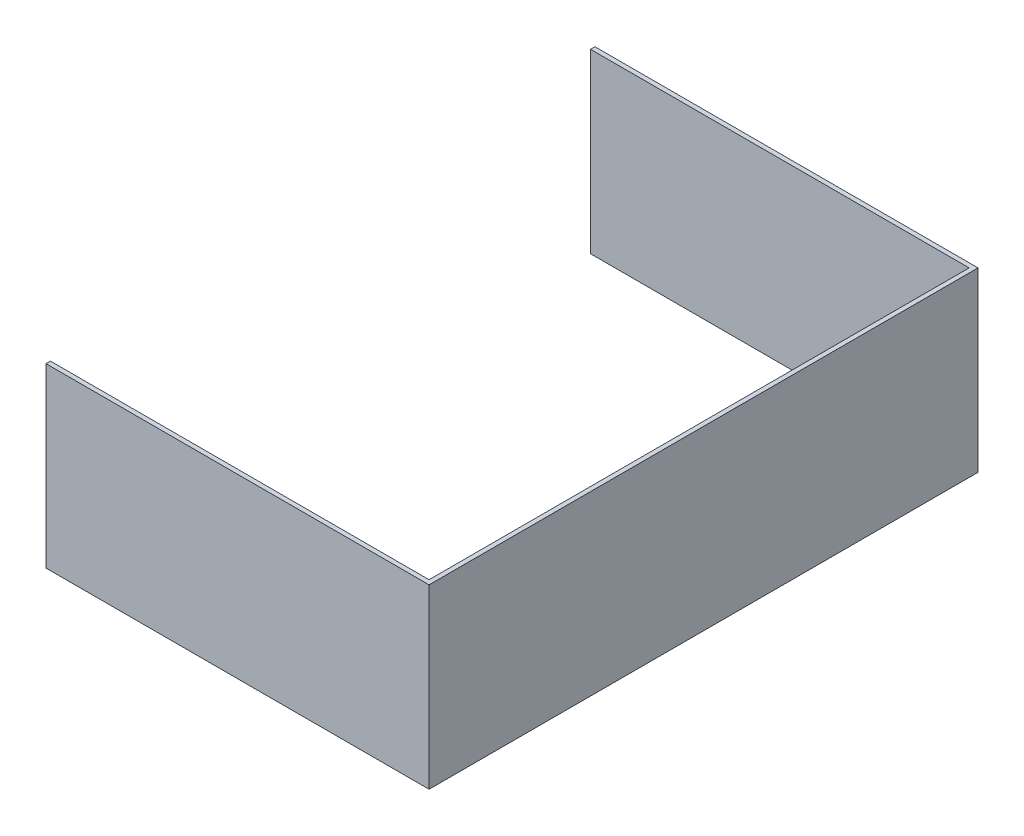
ISO-10303-21;
HEADER;
FILE_DESCRIPTION(('STEP AP214'),'2;1');
FILE_NAME('part.step','',(''),(''),'','','');
FILE_SCHEMA(('AUTOMOTIVE_DESIGN { 1 0 10303 214 1 1 1 1 }'));
ENDSEC;
DATA;
#1=APPLICATION_CONTEXT('core data for automotive mechanical design processes');
#2=APPLICATION_PROTOCOL_DEFINITION('international standard','automotive_design',2000,#1);
#3=PRODUCT_CONTEXT('',#1,'mechanical');
#4=PRODUCT('Part','Part','',(#3));
#5=PRODUCT_RELATED_PRODUCT_CATEGORY('part','',(#4));
#6=PRODUCT_DEFINITION_FORMATION('','',#4);
#7=PRODUCT_DEFINITION_CONTEXT('part definition',#1,'design');
#8=PRODUCT_DEFINITION('design','',#6,#7);
#9=PRODUCT_DEFINITION_SHAPE('','',#8);
#10=(LENGTH_UNIT() NAMED_UNIT(*) SI_UNIT(.MILLI.,.METRE.));
#11=(NAMED_UNIT(*) PLANE_ANGLE_UNIT() SI_UNIT($,.RADIAN.));
#12=(NAMED_UNIT(*) SI_UNIT($,.STERADIAN.) SOLID_ANGLE_UNIT());
#13=UNCERTAINTY_MEASURE_WITH_UNIT(LENGTH_MEASURE(1.E-05),#10,'distance_accuracy_value','');
#14=(GEOMETRIC_REPRESENTATION_CONTEXT(3) GLOBAL_UNCERTAINTY_ASSIGNED_CONTEXT((#13)) GLOBAL_UNIT_ASSIGNED_CONTEXT((#10,
#11,#12)) REPRESENTATION_CONTEXT('',''));
#15=CARTESIAN_POINT('',(0.,0.,0.));
#16=DIRECTION('',(0.,0.,1.));
#17=DIRECTION('',(1.,0.,0.));
#18=AXIS2_PLACEMENT_3D('',#15,#16,#17);
#19=CARTESIAN_POINT('',(0.,100.,-155.));
#20=DIRECTION('',(1.,0.,0.));
#21=DIRECTION('',(0.,0.,-1.));
#22=AXIS2_PLACEMENT_3D('',#19,#20,#21);
#23=PLANE('',#22);
#24=DIRECTION('',(0.,0.,1.));
#25=VECTOR('',#24,1.);
#26=CARTESIAN_POINT('',(0.,0.,-155.));
#27=LINE('',#26,#25);
#28=CARTESIAN_POINT('',(0.,0.,-155.));
#29=VERTEX_POINT('',#28);
#30=CARTESIAN_POINT('',(0.,0.,-152.5));
#31=VERTEX_POINT('',#30);
#32=EDGE_CURVE('E135',#29,#31,#27,.T.);
#33=ORIENTED_EDGE('',*,*,#32,.T.);
#34=DIRECTION('',(0.,-1.,0.));
#35=VECTOR('',#34,1.);
#36=CARTESIAN_POINT('',(0.,100.,-152.5));
#37=LINE('',#36,#35);
#38=CARTESIAN_POINT('',(0.,100.,-152.5));
#39=VERTEX_POINT('',#38);
#40=EDGE_CURVE('E11',#39,#31,#37,.T.);
#41=ORIENTED_EDGE('',*,*,#40,.F.);
#42=DIRECTION('',(0.,0.,1.));
#43=VECTOR('',#42,1.);
#44=CARTESIAN_POINT('',(0.,100.,-155.));
#45=LINE('',#44,#43);
#46=CARTESIAN_POINT('',(0.,100.,-155.));
#47=VERTEX_POINT('',#46);
#48=EDGE_CURVE('E149',#47,#39,#45,.T.);
#49=ORIENTED_EDGE('',*,*,#48,.F.);
#50=DIRECTION('',(0.,-1.,0.));
#51=VECTOR('',#50,1.);
#52=CARTESIAN_POINT('',(0.,100.,-155.));
#53=LINE('',#52,#51);
#54=EDGE_CURVE('E131',#47,#29,#53,.T.);
#55=ORIENTED_EDGE('',*,*,#54,.T.);
#56=EDGE_LOOP('',(#33,#41,#49,#55));
#57=FACE_BOUND('',#56,.T.);
#58=ADVANCED_FACE('F39',(#57),#23,.F.);
#59=CARTESIAN_POINT('',(0.,100.,-152.5));
#60=DIRECTION('',(0.,0.,-1.));
#61=DIRECTION('',(-1.,0.,0.));
#62=AXIS2_PLACEMENT_3D('',#59,#60,#61);
#63=PLANE('',#62);
#64=DIRECTION('',(1.,0.,0.));
#65=VECTOR('',#64,1.);
#66=CARTESIAN_POINT('',(0.,0.,-152.5));
#67=LINE('',#66,#65);
#68=CARTESIAN_POINT('',(213.83,0.,-152.5));
#69=VERTEX_POINT('',#68);
#70=EDGE_CURVE('E138',#31,#69,#67,.T.);
#71=ORIENTED_EDGE('',*,*,#70,.T.);
#72=DIRECTION('',(0.,-1.,0.));
#73=VECTOR('',#72,1.);
#74=CARTESIAN_POINT('',(213.83,100.,-152.5));
#75=LINE('',#74,#73);
#76=CARTESIAN_POINT('',(213.83,100.,-152.5));
#77=VERTEX_POINT('',#76);
#78=EDGE_CURVE('E47',#77,#69,#75,.T.);
#79=ORIENTED_EDGE('',*,*,#78,.F.);
#80=DIRECTION('',(1.,0.,0.));
#81=VECTOR('',#80,1.);
#82=CARTESIAN_POINT('',(0.,100.,-152.5));
#83=LINE('',#82,#81);
#84=EDGE_CURVE('E98',#39,#77,#83,.T.);
#85=ORIENTED_EDGE('',*,*,#84,.F.);
#86=ORIENTED_EDGE('',*,*,#40,.T.);
#87=EDGE_LOOP('',(#71,#79,#85,#86));
#88=FACE_BOUND('',#87,.T.);
#89=ADVANCED_FACE('F184',(#88),#63,.F.);
#90=CARTESIAN_POINT('',(213.83,100.,-152.5));
#91=DIRECTION('',(1.,0.,0.));
#92=DIRECTION('',(0.,0.,-1.));
#93=AXIS2_PLACEMENT_3D('',#90,#91,#92);
#94=PLANE('',#93);
#95=DIRECTION('',(0.,0.,1.));
#96=VECTOR('',#95,1.);
#97=CARTESIAN_POINT('',(213.83,0.,-152.5));
#98=LINE('',#97,#96);
#99=CARTESIAN_POINT('',(213.83,0.,152.5));
#100=VERTEX_POINT('',#99);
#101=EDGE_CURVE('E140',#69,#100,#98,.T.);
#102=ORIENTED_EDGE('',*,*,#101,.T.);
#103=DIRECTION('',(0.,-1.,0.));
#104=VECTOR('',#103,1.);
#105=CARTESIAN_POINT('',(213.83,100.,152.5));
#106=LINE('',#105,#104);
#107=CARTESIAN_POINT('',(213.83,100.,152.5));
#108=VERTEX_POINT('',#107);
#109=EDGE_CURVE('E156',#108,#100,#106,.T.);
#110=ORIENTED_EDGE('',*,*,#109,.F.);
#111=DIRECTION('',(0.,0.,1.));
#112=VECTOR('',#111,1.);
#113=CARTESIAN_POINT('',(213.83,100.,-152.5));
#114=LINE('',#113,#112);
#115=EDGE_CURVE('E164',#77,#108,#114,.T.);
#116=ORIENTED_EDGE('',*,*,#115,.F.);
#117=ORIENTED_EDGE('',*,*,#78,.T.);
#118=EDGE_LOOP('',(#102,#110,#116,#117));
#119=FACE_BOUND('',#118,.T.);
#120=ADVANCED_FACE('F162',(#119),#94,.F.);
#121=CARTESIAN_POINT('',(213.83,100.,152.5));
#122=DIRECTION('',(0.,0.,1.));
#123=DIRECTION('',(1.,0.,0.));
#124=AXIS2_PLACEMENT_3D('',#121,#122,#123);
#125=PLANE('',#124);
#126=DIRECTION('',(-1.,0.,0.));
#127=VECTOR('',#126,1.);
#128=CARTESIAN_POINT('',(213.83,0.,152.5));
#129=LINE('',#128,#127);
#130=CARTESIAN_POINT('',(0.,0.,152.5));
#131=VERTEX_POINT('',#130);
#132=EDGE_CURVE('E142',#100,#131,#129,.T.);
#133=ORIENTED_EDGE('',*,*,#132,.T.);
#134=DIRECTION('',(0.,-1.,0.));
#135=VECTOR('',#134,1.);
#136=CARTESIAN_POINT('',(0.,100.,152.5));
#137=LINE('',#136,#135);
#138=CARTESIAN_POINT('',(0.,100.,152.5));
#139=VERTEX_POINT('',#138);
#140=EDGE_CURVE('E153',#139,#131,#137,.T.);
#141=ORIENTED_EDGE('',*,*,#140,.F.);
#142=DIRECTION('',(-1.,0.,0.));
#143=VECTOR('',#142,1.);
#144=CARTESIAN_POINT('',(213.83,100.,152.5));
#145=LINE('',#144,#143);
#146=EDGE_CURVE('E176',#108,#139,#145,.T.);
#147=ORIENTED_EDGE('',*,*,#146,.F.);
#148=ORIENTED_EDGE('',*,*,#109,.T.);
#149=EDGE_LOOP('',(#133,#141,#147,#148));
#150=FACE_BOUND('',#149,.T.);
#151=ADVANCED_FACE('F172',(#150),#125,.F.);
#152=CARTESIAN_POINT('',(0.,100.,152.5));
#153=DIRECTION('',(1.,0.,0.));
#154=DIRECTION('',(0.,0.,-1.));
#155=AXIS2_PLACEMENT_3D('',#152,#153,#154);
#156=PLANE('',#155);
#157=DIRECTION('',(0.,0.,1.));
#158=VECTOR('',#157,1.);
#159=CARTESIAN_POINT('',(0.,0.,152.5));
#160=LINE('',#159,#158);
#161=CARTESIAN_POINT('',(0.,0.,155.));
#162=VERTEX_POINT('',#161);
#163=EDGE_CURVE('E144',#131,#162,#160,.T.);
#164=ORIENTED_EDGE('',*,*,#163,.T.);
#165=DIRECTION('',(0.,-1.,0.));
#166=VECTOR('',#165,1.);
#167=CARTESIAN_POINT('',(0.,100.,155.));
#168=LINE('',#167,#166);
#169=CARTESIAN_POINT('',(0.,100.,155.));
#170=VERTEX_POINT('',#169);
#171=EDGE_CURVE('E126',#170,#162,#168,.T.);
#172=ORIENTED_EDGE('',*,*,#171,.F.);
#173=DIRECTION('',(0.,0.,1.));
#174=VECTOR('',#173,1.);
#175=CARTESIAN_POINT('',(0.,100.,152.5));
#176=LINE('',#175,#174);
#177=EDGE_CURVE('E117',#139,#170,#176,.T.);
#178=ORIENTED_EDGE('',*,*,#177,.F.);
#179=ORIENTED_EDGE('',*,*,#140,.T.);
#180=EDGE_LOOP('',(#164,#172,#178,#179));
#181=FACE_BOUND('',#180,.T.);
#182=ADVANCED_FACE('F175',(#181),#156,.F.);
#183=CARTESIAN_POINT('',(0.,100.,155.));
#184=DIRECTION('',(0.,0.,-1.));
#185=DIRECTION('',(-1.,0.,0.));
#186=AXIS2_PLACEMENT_3D('',#183,#184,#185);
#187=PLANE('',#186);
#188=DIRECTION('',(1.,0.,0.));
#189=VECTOR('',#188,1.);
#190=CARTESIAN_POINT('',(0.,0.,155.));
#191=LINE('',#190,#189);
#192=CARTESIAN_POINT('',(216.33,0.,155.));
#193=VERTEX_POINT('',#192);
#194=EDGE_CURVE('E125',#162,#193,#191,.T.);
#195=ORIENTED_EDGE('',*,*,#194,.T.);
#196=DIRECTION('',(0.,-1.,0.));
#197=VECTOR('',#196,1.);
#198=CARTESIAN_POINT('',(216.33,100.,155.));
#199=LINE('',#198,#197);
#200=CARTESIAN_POINT('',(216.33,100.,155.));
#201=VERTEX_POINT('',#200);
#202=EDGE_CURVE('E122',#201,#193,#199,.T.);
#203=ORIENTED_EDGE('',*,*,#202,.F.);
#204=DIRECTION('',(1.,0.,0.));
#205=VECTOR('',#204,1.);
#206=CARTESIAN_POINT('',(0.,100.,155.));
#207=LINE('',#206,#205);
#208=EDGE_CURVE('E111',#170,#201,#207,.T.);
#209=ORIENTED_EDGE('',*,*,#208,.F.);
#210=ORIENTED_EDGE('',*,*,#171,.T.);
#211=EDGE_LOOP('',(#195,#203,#209,#210));
#212=FACE_BOUND('',#211,.T.);
#213=ADVANCED_FACE('F123',(#212),#187,.F.);
#214=CARTESIAN_POINT('',(216.33,100.,155.));
#215=DIRECTION('',(-1.,0.,0.));
#216=DIRECTION('',(0.,0.,1.));
#217=AXIS2_PLACEMENT_3D('',#214,#215,#216);
#218=PLANE('',#217);
#219=DIRECTION('',(0.,0.,-1.));
#220=VECTOR('',#219,1.);
#221=CARTESIAN_POINT('',(216.33,0.,155.));
#222=LINE('',#221,#220);
#223=CARTESIAN_POINT('',(216.33,0.,-155.));
#224=VERTEX_POINT('',#223);
#225=EDGE_CURVE('E84',#193,#224,#222,.T.);
#226=ORIENTED_EDGE('',*,*,#225,.T.);
#227=DIRECTION('',(0.,-1.,0.));
#228=VECTOR('',#227,1.);
#229=CARTESIAN_POINT('',(216.33,100.,-155.));
#230=LINE('',#229,#228);
#231=CARTESIAN_POINT('',(216.33,100.,-155.));
#232=VERTEX_POINT('',#231);
#233=EDGE_CURVE('E127',#232,#224,#230,.T.);
#234=ORIENTED_EDGE('',*,*,#233,.F.);
#235=DIRECTION('',(0.,0.,-1.));
#236=VECTOR('',#235,1.);
#237=CARTESIAN_POINT('',(216.33,100.,155.));
#238=LINE('',#237,#236);
#239=EDGE_CURVE('E115',#201,#232,#238,.T.);
#240=ORIENTED_EDGE('',*,*,#239,.F.);
#241=ORIENTED_EDGE('',*,*,#202,.T.);
#242=EDGE_LOOP('',(#226,#234,#240,#241));
#243=FACE_BOUND('',#242,.T.);
#244=ADVANCED_FACE('F129',(#243),#218,.F.);
#245=CARTESIAN_POINT('',(216.33,100.,-155.));
#246=DIRECTION('',(0.,0.,1.));
#247=DIRECTION('',(1.,0.,0.));
#248=AXIS2_PLACEMENT_3D('',#245,#246,#247);
#249=PLANE('',#248);
#250=DIRECTION('',(-1.,0.,0.));
#251=VECTOR('',#250,1.);
#252=CARTESIAN_POINT('',(216.33,0.,-155.));
#253=LINE('',#252,#251);
#254=EDGE_CURVE('E90',#224,#29,#253,.T.);
#255=ORIENTED_EDGE('',*,*,#254,.T.);
#256=ORIENTED_EDGE('',*,*,#54,.F.);
#257=DIRECTION('',(-1.,0.,0.));
#258=VECTOR('',#257,1.);
#259=CARTESIAN_POINT('',(216.33,100.,-155.));
#260=LINE('',#259,#258);
#261=EDGE_CURVE('E55',#232,#47,#260,.T.);
#262=ORIENTED_EDGE('',*,*,#261,.F.);
#263=ORIENTED_EDGE('',*,*,#233,.T.);
#264=EDGE_LOOP('',(#255,#256,#262,#263));
#265=FACE_BOUND('',#264,.T.);
#266=ADVANCED_FACE('F200',(#265),#249,.F.);
#267=CARTESIAN_POINT('',(0.,100.,0.));
#268=DIRECTION('',(0.,1.,0.));
#269=DIRECTION('',(0.,0.,1.));
#270=AXIS2_PLACEMENT_3D('',#267,#268,#269);
#271=PLANE('',#270);
#272=ORIENTED_EDGE('',*,*,#48,.T.);
#273=ORIENTED_EDGE('',*,*,#84,.T.);
#274=ORIENTED_EDGE('',*,*,#115,.T.);
#275=ORIENTED_EDGE('',*,*,#146,.T.);
#276=ORIENTED_EDGE('',*,*,#177,.T.);
#277=ORIENTED_EDGE('',*,*,#208,.T.);
#278=ORIENTED_EDGE('',*,*,#239,.T.);
#279=ORIENTED_EDGE('',*,*,#261,.T.);
#280=EDGE_LOOP('',(#272,#273,#274,#275,#276,#277,#278,#279));
#281=FACE_BOUND('',#280,.T.);
#282=ADVANCED_FACE('F113',(#281),#271,.T.);
#283=CARTESIAN_POINT('',(0.,0.,0.));
#284=DIRECTION('',(0.,1.,0.));
#285=DIRECTION('',(0.,0.,1.));
#286=AXIS2_PLACEMENT_3D('',#283,#284,#285);
#287=PLANE('',#286);
#288=ORIENTED_EDGE('',*,*,#32,.F.);
#289=ORIENTED_EDGE('',*,*,#254,.F.);
#290=ORIENTED_EDGE('',*,*,#225,.F.);
#291=ORIENTED_EDGE('',*,*,#194,.F.);
#292=ORIENTED_EDGE('',*,*,#163,.F.);
#293=ORIENTED_EDGE('',*,*,#132,.F.);
#294=ORIENTED_EDGE('',*,*,#101,.F.);
#295=ORIENTED_EDGE('',*,*,#70,.F.);
#296=EDGE_LOOP('',(#288,#289,#290,#291,#292,#293,#294,#295));
#297=FACE_BOUND('',#296,.T.);
#298=ADVANCED_FACE('F168',(#297),#287,.F.);
#299=CLOSED_SHELL('',(#58,#89,#120,#151,#182,#213,#244,#266,#282,#298));
#300=MANIFOLD_SOLID_BREP('B2',#299);
#301=ADVANCED_BREP_SHAPE_REPRESENTATION('',(#18,#300),#14);
#302=SHAPE_DEFINITION_REPRESENTATION(#9,#301);
ENDSEC;
END-ISO-10303-21;
